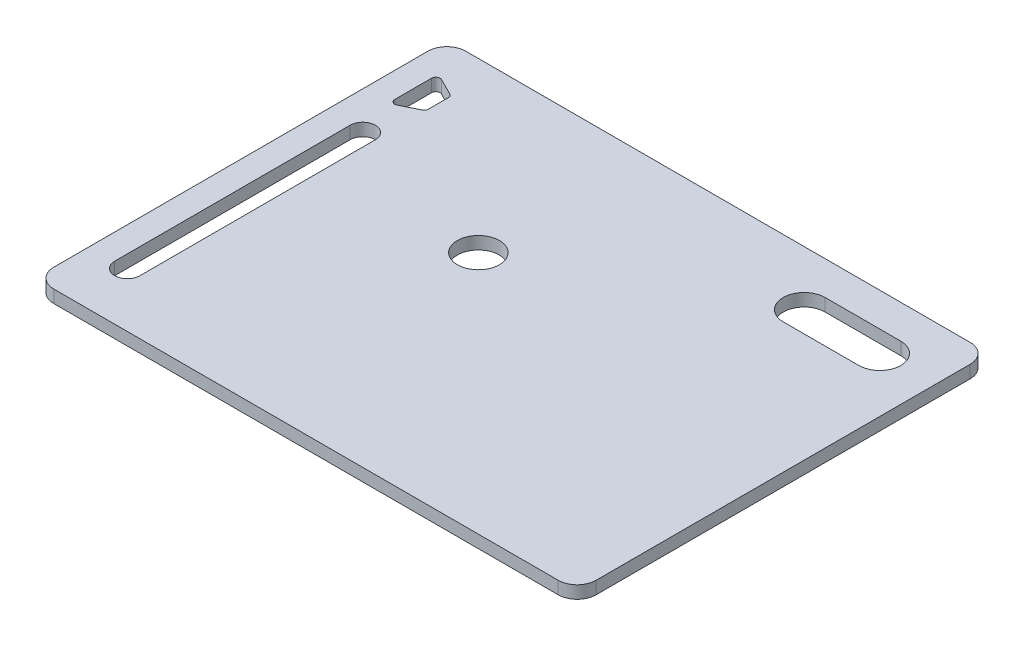
ISO-10303-21;
HEADER;
FILE_DESCRIPTION(('STEP AP214'),'2;1');
FILE_NAME('part.step','',(''),(''),'','','');
FILE_SCHEMA(('AUTOMOTIVE_DESIGN { 1 0 10303 214 1 1 1 1 }'));
ENDSEC;
DATA;
#1=APPLICATION_CONTEXT('core data for automotive mechanical design processes');
#2=APPLICATION_PROTOCOL_DEFINITION('international standard','automotive_design',2000,#1);
#3=PRODUCT_CONTEXT('',#1,'mechanical');
#4=PRODUCT('Part','Part','',(#3));
#5=PRODUCT_RELATED_PRODUCT_CATEGORY('part','',(#4));
#6=PRODUCT_DEFINITION_FORMATION('','',#4);
#7=PRODUCT_DEFINITION_CONTEXT('part definition',#1,'design');
#8=PRODUCT_DEFINITION('design','',#6,#7);
#9=PRODUCT_DEFINITION_SHAPE('','',#8);
#10=(LENGTH_UNIT() NAMED_UNIT(*) SI_UNIT(.MILLI.,.METRE.));
#11=(NAMED_UNIT(*) PLANE_ANGLE_UNIT() SI_UNIT($,.RADIAN.));
#12=(NAMED_UNIT(*) SI_UNIT($,.STERADIAN.) SOLID_ANGLE_UNIT());
#13=UNCERTAINTY_MEASURE_WITH_UNIT(LENGTH_MEASURE(1.E-05),#10,'distance_accuracy_value','');
#14=(GEOMETRIC_REPRESENTATION_CONTEXT(3) GLOBAL_UNCERTAINTY_ASSIGNED_CONTEXT((#13)) GLOBAL_UNIT_ASSIGNED_CONTEXT((#10,
#11,#12)) REPRESENTATION_CONTEXT('',''));
#15=CARTESIAN_POINT('',(0.,0.,0.));
#16=DIRECTION('',(0.,0.,1.));
#17=DIRECTION('',(1.,0.,0.));
#18=AXIS2_PLACEMENT_3D('',#15,#16,#17);
#19=CARTESIAN_POINT('',(409.575,19.05,311.15));
#20=DIRECTION('',(-1.,0.,0.));
#21=DIRECTION('',(0.,0.,1.));
#22=AXIS2_PLACEMENT_3D('',#19,#20,#21);
#23=PLANE('',#22);
#24=DIRECTION('',(0.,0.,-1.));
#25=VECTOR('',#24,1.);
#26=CARTESIAN_POINT('',(409.575,0.,311.15));
#27=LINE('',#26,#25);
#28=CARTESIAN_POINT('',(409.575,0.,282.575));
#29=VERTEX_POINT('',#28);
#30=CARTESIAN_POINT('',(409.575,0.,-282.575));
#31=VERTEX_POINT('',#30);
#32=EDGE_CURVE('E289',#29,#31,#27,.T.);
#33=ORIENTED_EDGE('',*,*,#32,.T.);
#34=DIRECTION('',(0.,-1.,0.));
#35=VECTOR('',#34,1.);
#36=CARTESIAN_POINT('',(409.575,19.05,-282.575));
#37=LINE('',#36,#35);
#38=CARTESIAN_POINT('',(409.575,19.05,-282.575));
#39=VERTEX_POINT('',#38);
#40=EDGE_CURVE('E344',#31,#39,#37,.F.);
#41=ORIENTED_EDGE('',*,*,#40,.T.);
#42=DIRECTION('',(0.,0.,-1.));
#43=VECTOR('',#42,1.);
#44=CARTESIAN_POINT('',(409.575,19.05,311.15));
#45=LINE('',#44,#43);
#46=CARTESIAN_POINT('',(409.575,19.05,282.575));
#47=VERTEX_POINT('',#46);
#48=EDGE_CURVE('E292',#47,#39,#45,.T.);
#49=ORIENTED_EDGE('',*,*,#48,.F.);
#50=DIRECTION('',(0.,-1.,0.));
#51=VECTOR('',#50,1.);
#52=CARTESIAN_POINT('',(409.575,19.05,282.575));
#53=LINE('',#52,#51);
#54=EDGE_CURVE('E341',#47,#29,#53,.T.);
#55=ORIENTED_EDGE('',*,*,#54,.T.);
#56=EDGE_LOOP('',(#33,#41,#49,#55));
#57=FACE_BOUND('',#56,.T.);
#58=ADVANCED_FACE('F33',(#57),#23,.F.);
#59=CARTESIAN_POINT('',(-409.575,19.05,-311.15));
#60=DIRECTION('',(0.,0.,1.));
#61=DIRECTION('',(1.,0.,0.));
#62=AXIS2_PLACEMENT_3D('',#59,#60,#61);
#63=PLANE('',#62);
#64=DIRECTION('',(-1.,0.,0.));
#65=VECTOR('',#64,1.);
#66=CARTESIAN_POINT('',(-409.575,0.,-311.15));
#67=LINE('',#66,#65);
#68=CARTESIAN_POINT('',(381.,0.,-311.15));
#69=VERTEX_POINT('',#68);
#70=CARTESIAN_POINT('',(-381.,0.,-311.15));
#71=VERTEX_POINT('',#70);
#72=EDGE_CURVE('E308',#69,#71,#67,.T.);
#73=ORIENTED_EDGE('',*,*,#72,.T.);
#74=DIRECTION('',(0.,-1.,0.));
#75=VECTOR('',#74,1.);
#76=CARTESIAN_POINT('',(-381.,19.05,-311.15));
#77=LINE('',#76,#75);
#78=CARTESIAN_POINT('',(-381.,19.05,-311.15));
#79=VERTEX_POINT('',#78);
#80=EDGE_CURVE('E331',#71,#79,#77,.F.);
#81=ORIENTED_EDGE('',*,*,#80,.T.);
#82=DIRECTION('',(-1.,0.,0.));
#83=VECTOR('',#82,1.);
#84=CARTESIAN_POINT('',(-409.575,19.05,-311.15));
#85=LINE('',#84,#83);
#86=CARTESIAN_POINT('',(381.,19.05,-311.15));
#87=VERTEX_POINT('',#86);
#88=EDGE_CURVE('E295',#87,#79,#85,.T.);
#89=ORIENTED_EDGE('',*,*,#88,.F.);
#90=DIRECTION('',(0.,-1.,0.));
#91=VECTOR('',#90,1.);
#92=CARTESIAN_POINT('',(381.,19.05,-311.15));
#93=LINE('',#92,#91);
#94=EDGE_CURVE('E328',#87,#69,#93,.T.);
#95=ORIENTED_EDGE('',*,*,#94,.T.);
#96=EDGE_LOOP('',(#73,#81,#89,#95));
#97=FACE_BOUND('',#96,.T.);
#98=ADVANCED_FACE('F431',(#97),#63,.F.);
#99=CARTESIAN_POINT('',(-409.575,19.05,311.15));
#100=DIRECTION('',(1.,0.,0.));
#101=DIRECTION('',(0.,0.,-1.));
#102=AXIS2_PLACEMENT_3D('',#99,#100,#101);
#103=PLANE('',#102);
#104=DIRECTION('',(0.,0.,1.));
#105=VECTOR('',#104,1.);
#106=CARTESIAN_POINT('',(-409.575,19.05,311.15));
#107=LINE('',#106,#105);
#108=CARTESIAN_POINT('',(-409.575,19.05,-282.575));
#109=VERTEX_POINT('',#108);
#110=CARTESIAN_POINT('',(-409.575,19.05,282.575));
#111=VERTEX_POINT('',#110);
#112=EDGE_CURVE('E299',#109,#111,#107,.T.);
#113=ORIENTED_EDGE('',*,*,#112,.F.);
#114=DIRECTION('',(0.,-1.,0.));
#115=VECTOR('',#114,1.);
#116=CARTESIAN_POINT('',(-409.575,19.05,-282.575));
#117=LINE('',#116,#115);
#118=CARTESIAN_POINT('',(-409.575,0.,-282.575));
#119=VERTEX_POINT('',#118);
#120=EDGE_CURVE('E317',#109,#119,#117,.T.);
#121=ORIENTED_EDGE('',*,*,#120,.T.);
#122=DIRECTION('',(0.,0.,1.));
#123=VECTOR('',#122,1.);
#124=CARTESIAN_POINT('',(-409.575,0.,311.15));
#125=LINE('',#124,#123);
#126=CARTESIAN_POINT('',(-409.575,0.,282.575));
#127=VERTEX_POINT('',#126);
#128=EDGE_CURVE('E311',#119,#127,#125,.T.);
#129=ORIENTED_EDGE('',*,*,#128,.T.);
#130=DIRECTION('',(0.,-1.,0.));
#131=VECTOR('',#130,1.);
#132=CARTESIAN_POINT('',(-409.575,19.05,282.575));
#133=LINE('',#132,#131);
#134=EDGE_CURVE('E305',#127,#111,#133,.F.);
#135=ORIENTED_EDGE('',*,*,#134,.T.);
#136=EDGE_LOOP('',(#113,#121,#129,#135));
#137=FACE_BOUND('',#136,.T.);
#138=ADVANCED_FACE('F437',(#137),#103,.F.);
#139=CARTESIAN_POINT('',(-409.575,19.05,311.15));
#140=DIRECTION('',(0.,0.,-1.));
#141=DIRECTION('',(-1.,0.,0.));
#142=AXIS2_PLACEMENT_3D('',#139,#140,#141);
#143=PLANE('',#142);
#144=DIRECTION('',(1.,0.,0.));
#145=VECTOR('',#144,1.);
#146=CARTESIAN_POINT('',(-409.575,19.05,311.15));
#147=LINE('',#146,#145);
#148=CARTESIAN_POINT('',(-381.,19.05,311.15));
#149=VERTEX_POINT('',#148);
#150=CARTESIAN_POINT('',(381.,19.05,311.15));
#151=VERTEX_POINT('',#150);
#152=EDGE_CURVE('E302',#149,#151,#147,.T.);
#153=ORIENTED_EDGE('',*,*,#152,.F.);
#154=DIRECTION('',(0.,-1.,0.));
#155=VECTOR('',#154,1.);
#156=CARTESIAN_POINT('',(-381.,19.05,311.15));
#157=LINE('',#156,#155);
#158=CARTESIAN_POINT('',(-381.,0.,311.15));
#159=VERTEX_POINT('',#158);
#160=EDGE_CURVE('E348',#149,#159,#157,.T.);
#161=ORIENTED_EDGE('',*,*,#160,.T.);
#162=DIRECTION('',(1.,0.,0.));
#163=VECTOR('',#162,1.);
#164=CARTESIAN_POINT('',(-409.575,0.,311.15));
#165=LINE('',#164,#163);
#166=CARTESIAN_POINT('',(381.,0.,311.15));
#167=VERTEX_POINT('',#166);
#168=EDGE_CURVE('E296',#159,#167,#165,.T.);
#169=ORIENTED_EDGE('',*,*,#168,.T.);
#170=DIRECTION('',(0.,-1.,0.));
#171=VECTOR('',#170,1.);
#172=CARTESIAN_POINT('',(381.,19.05,311.15));
#173=LINE('',#172,#171);
#174=EDGE_CURVE('E346',#167,#151,#173,.F.);
#175=ORIENTED_EDGE('',*,*,#174,.T.);
#176=EDGE_LOOP('',(#153,#161,#169,#175));
#177=FACE_BOUND('',#176,.T.);
#178=ADVANCED_FACE('F485',(#177),#143,.F.);
#179=CARTESIAN_POINT('',(0.,19.05,0.));
#180=DIRECTION('',(0.,-1.,0.));
#181=DIRECTION('',(0.,0.,-1.));
#182=AXIS2_PLACEMENT_3D('',#179,#180,#181);
#183=PLANE('',#182);
#184=DIRECTION('',(-1.,0.,0.));
#185=VECTOR('',#184,1.);
#186=CARTESIAN_POINT('',(327.025,19.05,-260.35));
#187=LINE('',#186,#185);
#188=CARTESIAN_POINT('',(327.025,19.05,-260.35));
#189=VERTEX_POINT('',#188);
#190=CARTESIAN_POINT('',(212.725,19.05,-260.35));
#191=VERTEX_POINT('',#190);
#192=EDGE_CURVE('E220',#189,#191,#187,.T.);
#193=ORIENTED_EDGE('',*,*,#192,.F.);
#194=CARTESIAN_POINT('',(327.025,19.05,-228.6));
#195=DIRECTION('',(0.,1.,0.));
#196=DIRECTION('',(0.,0.,1.));
#197=AXIS2_PLACEMENT_3D('',#194,#195,#196);
#198=CIRCLE('',#197,31.75);
#199=CARTESIAN_POINT('',(327.025,19.05,-196.85));
#200=VERTEX_POINT('',#199);
#201=EDGE_CURVE('E48',#200,#189,#198,.T.);
#202=ORIENTED_EDGE('',*,*,#201,.F.);
#203=DIRECTION('',(1.,0.,0.));
#204=VECTOR('',#203,1.);
#205=CARTESIAN_POINT('',(327.025,19.05,-196.85));
#206=LINE('',#205,#204);
#207=CARTESIAN_POINT('',(212.725,19.05,-196.85));
#208=VERTEX_POINT('',#207);
#209=EDGE_CURVE('E211',#208,#200,#206,.T.);
#210=ORIENTED_EDGE('',*,*,#209,.F.);
#211=CARTESIAN_POINT('',(212.725,19.05,-228.6));
#212=DIRECTION('',(0.,1.,0.));
#213=DIRECTION('',(0.,0.,1.));
#214=AXIS2_PLACEMENT_3D('',#211,#212,#213);
#215=CIRCLE('',#214,31.7499999999999);
#216=EDGE_CURVE('E214',#191,#208,#215,.T.);
#217=ORIENTED_EDGE('',*,*,#216,.F.);
#218=EDGE_LOOP('',(#193,#202,#210,#217));
#219=FACE_BOUND('',#218,.T.);
#220=DIRECTION('',(0.,0.,1.));
#221=VECTOR('',#220,1.);
#222=CARTESIAN_POINT('',(-371.475,19.05,-260.35));
#223=LINE('',#222,#221);
#224=CARTESIAN_POINT('',(-371.475,19.05,-250.075484171438));
#225=VERTEX_POINT('',#224);
#226=CARTESIAN_POINT('',(-371.475,19.05,-194.424515828562));
#227=VERTEX_POINT('',#226);
#228=EDGE_CURVE('E246',#225,#227,#223,.T.);
#229=ORIENTED_EDGE('',*,*,#228,.F.);
#230=CARTESIAN_POINT('',(-365.125,19.05,-250.075484171438));
#231=DIRECTION('',(0.,-1.,0.));
#232=DIRECTION('',(0.,0.,-1.));
#233=AXIS2_PLACEMENT_3D('',#230,#231,#232);
#234=CIRCLE('',#233,6.35);
#235=CARTESIAN_POINT('',(-362.285193668575,19.05,-255.755096834288));
#236=VERTEX_POINT('',#235);
#237=EDGE_CURVE('E41',#225,#236,#234,.T.);
#238=ORIENTED_EDGE('',*,*,#237,.T.);
#239=DIRECTION('',(-0.894427190999916,0.,-0.447213595499957));
#240=VECTOR('',#239,1.);
#241=CARTESIAN_POINT('',(-333.375,19.05,-241.3));
#242=LINE('',#241,#240);
#243=CARTESIAN_POINT('',(-336.885193668575,19.05,-243.055096834288));
#244=VERTEX_POINT('',#243);
#245=EDGE_CURVE('E226',#244,#236,#242,.T.);
#246=ORIENTED_EDGE('',*,*,#245,.F.);
#247=CARTESIAN_POINT('',(-339.725,19.05,-237.375484171438));
#248=DIRECTION('',(0.,-1.,0.));
#249=DIRECTION('',(0.,0.,-1.));
#250=AXIS2_PLACEMENT_3D('',#247,#248,#249);
#251=CIRCLE('',#250,6.35);
#252=CARTESIAN_POINT('',(-333.375,19.05,-237.375484171438));
#253=VERTEX_POINT('',#252);
#254=EDGE_CURVE('E371',#244,#253,#251,.T.);
#255=ORIENTED_EDGE('',*,*,#254,.T.);
#256=DIRECTION('',(0.,0.,-1.));
#257=VECTOR('',#256,1.);
#258=CARTESIAN_POINT('',(-333.375,19.05,-203.2));
#259=LINE('',#258,#257);
#260=CARTESIAN_POINT('',(-333.375,19.05,-207.124515828562));
#261=VERTEX_POINT('',#260);
#262=EDGE_CURVE('E234',#261,#253,#259,.T.);
#263=ORIENTED_EDGE('',*,*,#262,.F.);
#264=CARTESIAN_POINT('',(-339.725,19.05,-207.124515828562));
#265=DIRECTION('',(0.,-1.,0.));
#266=DIRECTION('',(0.,0.,-1.));
#267=AXIS2_PLACEMENT_3D('',#264,#265,#266);
#268=CIRCLE('',#267,6.35);
#269=CARTESIAN_POINT('',(-336.885193668575,19.05,-201.444903165712));
#270=VERTEX_POINT('',#269);
#271=EDGE_CURVE('E375',#261,#270,#268,.T.);
#272=ORIENTED_EDGE('',*,*,#271,.T.);
#273=DIRECTION('',(0.894427190999916,0.,-0.447213595499957));
#274=VECTOR('',#273,1.);
#275=CARTESIAN_POINT('',(-371.475,19.05,-184.15));
#276=LINE('',#275,#274);
#277=CARTESIAN_POINT('',(-362.285193668575,19.05,-188.744903165712));
#278=VERTEX_POINT('',#277);
#279=EDGE_CURVE('E249',#278,#270,#276,.T.);
#280=ORIENTED_EDGE('',*,*,#279,.F.);
#281=CARTESIAN_POINT('',(-365.125,19.05,-194.424515828562));
#282=DIRECTION('',(0.,-1.,0.));
#283=DIRECTION('',(0.,0.,-1.));
#284=AXIS2_PLACEMENT_3D('',#281,#282,#283);
#285=CIRCLE('',#284,6.35);
#286=EDGE_CURVE('E379',#278,#227,#285,.T.);
#287=ORIENTED_EDGE('',*,*,#286,.T.);
#288=EDGE_LOOP('',(#229,#238,#246,#255,#263,#272,#280,#287));
#289=FACE_BOUND('',#288,.T.);
#290=DIRECTION('',(0.,0.,1.));
#291=VECTOR('',#290,1.);
#292=CARTESIAN_POINT('',(-371.475,19.05,-127.));
#293=LINE('',#292,#291);
#294=CARTESIAN_POINT('',(-371.475,19.05,-127.));
#295=VERTEX_POINT('',#294);
#296=CARTESIAN_POINT('',(-371.475,19.05,228.6));
#297=VERTEX_POINT('',#296);
#298=EDGE_CURVE('E269',#295,#297,#293,.T.);
#299=ORIENTED_EDGE('',*,*,#298,.F.);
#300=CARTESIAN_POINT('',(-352.425,19.05,-127.));
#301=DIRECTION('',(0.,1.,0.));
#302=DIRECTION('',(0.,0.,1.));
#303=AXIS2_PLACEMENT_3D('',#300,#301,#302);
#304=CIRCLE('',#303,19.05);
#305=CARTESIAN_POINT('',(-333.375,19.05,-127.));
#306=VERTEX_POINT('',#305);
#307=EDGE_CURVE('E243',#306,#295,#304,.T.);
#308=ORIENTED_EDGE('',*,*,#307,.F.);
#309=DIRECTION('',(0.,0.,-1.));
#310=VECTOR('',#309,1.);
#311=CARTESIAN_POINT('',(-333.375,19.05,-127.));
#312=LINE('',#311,#310);
#313=CARTESIAN_POINT('',(-333.375,19.05,228.6));
#314=VERTEX_POINT('',#313);
#315=EDGE_CURVE('E258',#314,#306,#312,.T.);
#316=ORIENTED_EDGE('',*,*,#315,.F.);
#317=CARTESIAN_POINT('',(-352.425,19.05,228.6));
#318=DIRECTION('',(0.,1.,0.));
#319=DIRECTION('',(0.,0.,1.));
#320=AXIS2_PLACEMENT_3D('',#317,#318,#319);
#321=CIRCLE('',#320,19.0500000000001);
#322=EDGE_CURVE('E272',#297,#314,#321,.T.);
#323=ORIENTED_EDGE('',*,*,#322,.F.);
#324=EDGE_LOOP('',(#299,#308,#316,#323));
#325=FACE_BOUND('',#324,.T.);
#326=CARTESIAN_POINT('',(-107.95,19.05,-57.15));
#327=DIRECTION('',(0.,1.,0.));
#328=DIRECTION('',(0.,0.,1.));
#329=AXIS2_PLACEMENT_3D('',#326,#327,#328);
#330=CIRCLE('',#329,31.75);
#331=CARTESIAN_POINT('',(-107.95,19.05,-25.4));
#332=VERTEX_POINT('',#331);
#333=EDGE_CURVE('E279',#332,#332,#330,.T.);
#334=ORIENTED_EDGE('',*,*,#333,.F.);
#335=EDGE_LOOP('',(#334));
#336=FACE_BOUND('',#335,.T.);
#337=ORIENTED_EDGE('',*,*,#88,.T.);
#338=CARTESIAN_POINT('',(-381.,19.05,-282.575));
#339=DIRECTION('',(0.,-1.,0.));
#340=DIRECTION('',(0.,0.,-1.));
#341=AXIS2_PLACEMENT_3D('',#338,#339,#340);
#342=CIRCLE('',#341,28.575);
#343=EDGE_CURVE('E339',#79,#109,#342,.F.);
#344=ORIENTED_EDGE('',*,*,#343,.T.);
#345=ORIENTED_EDGE('',*,*,#112,.T.);
#346=CARTESIAN_POINT('',(-381.,19.05,282.575));
#347=DIRECTION('',(0.,-1.,0.));
#348=DIRECTION('',(0.,0.,-1.));
#349=AXIS2_PLACEMENT_3D('',#346,#347,#348);
#350=CIRCLE('',#349,28.575);
#351=EDGE_CURVE('E335',#111,#149,#350,.F.);
#352=ORIENTED_EDGE('',*,*,#351,.T.);
#353=ORIENTED_EDGE('',*,*,#152,.T.);
#354=CARTESIAN_POINT('',(381.,19.05,282.575));
#355=DIRECTION('',(0.,-1.,0.));
#356=DIRECTION('',(0.,0.,-1.));
#357=AXIS2_PLACEMENT_3D('',#354,#355,#356);
#358=CIRCLE('',#357,28.575);
#359=EDGE_CURVE('E333',#151,#47,#358,.F.);
#360=ORIENTED_EDGE('',*,*,#359,.T.);
#361=ORIENTED_EDGE('',*,*,#48,.T.);
#362=CARTESIAN_POINT('',(381.,19.05,-282.575));
#363=DIRECTION('',(0.,-1.,0.));
#364=DIRECTION('',(0.,0.,-1.));
#365=AXIS2_PLACEMENT_3D('',#362,#363,#364);
#366=CIRCLE('',#365,28.575);
#367=EDGE_CURVE('E337',#39,#87,#366,.F.);
#368=ORIENTED_EDGE('',*,*,#367,.T.);
#369=EDGE_LOOP('',(#337,#344,#345,#352,#353,#360,#361,#368));
#370=FACE_BOUND('',#369,.T.);
#371=ADVANCED_FACE('F385',(#219,#289,#325,#336,#370),#183,.F.);
#372=CARTESIAN_POINT('',(0.,0.,0.));
#373=DIRECTION('',(0.,-1.,0.));
#374=DIRECTION('',(0.,0.,-1.));
#375=AXIS2_PLACEMENT_3D('',#372,#373,#374);
#376=PLANE('',#375);
#377=CARTESIAN_POINT('',(327.025,0.,-228.6));
#378=DIRECTION('',(0.,1.,0.));
#379=DIRECTION('',(0.,0.,1.));
#380=AXIS2_PLACEMENT_3D('',#377,#378,#379);
#381=CIRCLE('',#380,31.75);
#382=CARTESIAN_POINT('',(327.025,0.,-196.85));
#383=VERTEX_POINT('',#382);
#384=CARTESIAN_POINT('',(327.025,0.,-260.35));
#385=VERTEX_POINT('',#384);
#386=EDGE_CURVE('E195',#383,#385,#381,.T.);
#387=ORIENTED_EDGE('',*,*,#386,.T.);
#388=DIRECTION('',(-1.,0.,0.));
#389=VECTOR('',#388,1.);
#390=CARTESIAN_POINT('',(327.025,0.,-260.35));
#391=LINE('',#390,#389);
#392=CARTESIAN_POINT('',(212.725,0.,-260.35));
#393=VERTEX_POINT('',#392);
#394=EDGE_CURVE('E204',#385,#393,#391,.T.);
#395=ORIENTED_EDGE('',*,*,#394,.T.);
#396=CARTESIAN_POINT('',(212.725,0.,-228.6));
#397=DIRECTION('',(0.,1.,0.));
#398=DIRECTION('',(0.,0.,1.));
#399=AXIS2_PLACEMENT_3D('',#396,#397,#398);
#400=CIRCLE('',#399,31.7499999999999);
#401=CARTESIAN_POINT('',(212.725,0.,-196.85));
#402=VERTEX_POINT('',#401);
#403=EDGE_CURVE('E56',#393,#402,#400,.T.);
#404=ORIENTED_EDGE('',*,*,#403,.T.);
#405=DIRECTION('',(1.,0.,0.));
#406=VECTOR('',#405,1.);
#407=CARTESIAN_POINT('',(327.025,0.,-196.85));
#408=LINE('',#407,#406);
#409=EDGE_CURVE('E201',#402,#383,#408,.T.);
#410=ORIENTED_EDGE('',*,*,#409,.T.);
#411=EDGE_LOOP('',(#387,#395,#404,#410));
#412=FACE_BOUND('',#411,.T.);
#413=DIRECTION('',(0.,0.,-1.));
#414=VECTOR('',#413,1.);
#415=CARTESIAN_POINT('',(-333.375,0.,-203.2));
#416=LINE('',#415,#414);
#417=CARTESIAN_POINT('',(-333.375,0.,-207.124515828562));
#418=VERTEX_POINT('',#417);
#419=CARTESIAN_POINT('',(-333.375,0.,-237.375484171438));
#420=VERTEX_POINT('',#419);
#421=EDGE_CURVE('E240',#418,#420,#416,.T.);
#422=ORIENTED_EDGE('',*,*,#421,.T.);
#423=CARTESIAN_POINT('',(-339.725,0.,-237.375484171438));
#424=DIRECTION('',(0.,-1.,0.));
#425=DIRECTION('',(0.,0.,-1.));
#426=AXIS2_PLACEMENT_3D('',#423,#424,#425);
#427=CIRCLE('',#426,6.35);
#428=CARTESIAN_POINT('',(-336.885193668575,0.,-243.055096834288));
#429=VERTEX_POINT('',#428);
#430=EDGE_CURVE('E373',#420,#429,#427,.F.);
#431=ORIENTED_EDGE('',*,*,#430,.T.);
#432=DIRECTION('',(-0.894427190999916,0.,-0.447213595499957));
#433=VECTOR('',#432,1.);
#434=CARTESIAN_POINT('',(-333.375,0.,-241.3));
#435=LINE('',#434,#433);
#436=CARTESIAN_POINT('',(-362.285193668575,0.,-255.755096834288));
#437=VERTEX_POINT('',#436);
#438=EDGE_CURVE('E230',#429,#437,#435,.T.);
#439=ORIENTED_EDGE('',*,*,#438,.T.);
#440=CARTESIAN_POINT('',(-365.125,0.,-250.075484171438));
#441=DIRECTION('',(0.,-1.,0.));
#442=DIRECTION('',(0.,0.,-1.));
#443=AXIS2_PLACEMENT_3D('',#440,#441,#442);
#444=CIRCLE('',#443,6.35);
#445=CARTESIAN_POINT('',(-371.475,0.,-250.075484171438));
#446=VERTEX_POINT('',#445);
#447=EDGE_CURVE('E11',#437,#446,#444,.F.);
#448=ORIENTED_EDGE('',*,*,#447,.T.);
#449=DIRECTION('',(0.,0.,1.));
#450=VECTOR('',#449,1.);
#451=CARTESIAN_POINT('',(-371.475,0.,-260.35));
#452=LINE('',#451,#450);
#453=CARTESIAN_POINT('',(-371.475,0.,-194.424515828562));
#454=VERTEX_POINT('',#453);
#455=EDGE_CURVE('E233',#446,#454,#452,.T.);
#456=ORIENTED_EDGE('',*,*,#455,.T.);
#457=CARTESIAN_POINT('',(-365.125,0.,-194.424515828562));
#458=DIRECTION('',(0.,-1.,0.));
#459=DIRECTION('',(0.,0.,-1.));
#460=AXIS2_PLACEMENT_3D('',#457,#458,#459);
#461=CIRCLE('',#460,6.35);
#462=CARTESIAN_POINT('',(-362.285193668575,0.,-188.744903165712));
#463=VERTEX_POINT('',#462);
#464=EDGE_CURVE('E381',#454,#463,#461,.F.);
#465=ORIENTED_EDGE('',*,*,#464,.T.);
#466=DIRECTION('',(0.894427190999916,0.,-0.447213595499957));
#467=VECTOR('',#466,1.);
#468=CARTESIAN_POINT('',(-371.475,0.,-184.15));
#469=LINE('',#468,#467);
#470=CARTESIAN_POINT('',(-336.885193668575,0.,-201.444903165712));
#471=VERTEX_POINT('',#470);
#472=EDGE_CURVE('E237',#463,#471,#469,.T.);
#473=ORIENTED_EDGE('',*,*,#472,.T.);
#474=CARTESIAN_POINT('',(-339.725,0.,-207.124515828562));
#475=DIRECTION('',(0.,-1.,0.));
#476=DIRECTION('',(0.,0.,-1.));
#477=AXIS2_PLACEMENT_3D('',#474,#475,#476);
#478=CIRCLE('',#477,6.35);
#479=EDGE_CURVE('E377',#471,#418,#478,.F.);
#480=ORIENTED_EDGE('',*,*,#479,.T.);
#481=EDGE_LOOP('',(#422,#431,#439,#448,#456,#465,#473,#480));
#482=FACE_BOUND('',#481,.T.);
#483=CARTESIAN_POINT('',(-352.425,0.,-127.));
#484=DIRECTION('',(0.,1.,0.));
#485=DIRECTION('',(0.,0.,1.));
#486=AXIS2_PLACEMENT_3D('',#483,#484,#485);
#487=CIRCLE('',#486,19.05);
#488=CARTESIAN_POINT('',(-333.375,0.,-127.));
#489=VERTEX_POINT('',#488);
#490=CARTESIAN_POINT('',(-371.475,0.,-127.));
#491=VERTEX_POINT('',#490);
#492=EDGE_CURVE('E254',#489,#491,#487,.T.);
#493=ORIENTED_EDGE('',*,*,#492,.T.);
#494=DIRECTION('',(0.,0.,1.));
#495=VECTOR('',#494,1.);
#496=CARTESIAN_POINT('',(-371.475,0.,-127.));
#497=LINE('',#496,#495);
#498=CARTESIAN_POINT('',(-371.475,0.,228.6));
#499=VERTEX_POINT('',#498);
#500=EDGE_CURVE('E257',#491,#499,#497,.T.);
#501=ORIENTED_EDGE('',*,*,#500,.T.);
#502=CARTESIAN_POINT('',(-352.425,0.,228.6));
#503=DIRECTION('',(0.,1.,0.));
#504=DIRECTION('',(0.,0.,1.));
#505=AXIS2_PLACEMENT_3D('',#502,#503,#504);
#506=CIRCLE('',#505,19.0500000000001);
#507=CARTESIAN_POINT('',(-333.375,0.,228.6));
#508=VERTEX_POINT('',#507);
#509=EDGE_CURVE('E261',#499,#508,#506,.T.);
#510=ORIENTED_EDGE('',*,*,#509,.T.);
#511=DIRECTION('',(0.,0.,-1.));
#512=VECTOR('',#511,1.);
#513=CARTESIAN_POINT('',(-333.375,0.,-127.));
#514=LINE('',#513,#512);
#515=EDGE_CURVE('E264',#508,#489,#514,.T.);
#516=ORIENTED_EDGE('',*,*,#515,.T.);
#517=EDGE_LOOP('',(#493,#501,#510,#516));
#518=FACE_BOUND('',#517,.T.);
#519=CARTESIAN_POINT('',(-107.95,0.,-57.15));
#520=DIRECTION('',(0.,1.,0.));
#521=DIRECTION('',(0.,0.,1.));
#522=AXIS2_PLACEMENT_3D('',#519,#520,#521);
#523=CIRCLE('',#522,31.75);
#524=CARTESIAN_POINT('',(-107.95,0.,-25.4));
#525=VERTEX_POINT('',#524);
#526=EDGE_CURVE('E286',#525,#525,#523,.T.);
#527=ORIENTED_EDGE('',*,*,#526,.T.);
#528=EDGE_LOOP('',(#527));
#529=FACE_BOUND('',#528,.T.);
#530=ORIENTED_EDGE('',*,*,#128,.F.);
#531=CARTESIAN_POINT('',(-381.,0.,-282.575));
#532=DIRECTION('',(0.,-1.,0.));
#533=DIRECTION('',(0.,0.,-1.));
#534=AXIS2_PLACEMENT_3D('',#531,#532,#533);
#535=CIRCLE('',#534,28.575);
#536=EDGE_CURVE('E326',#119,#71,#535,.T.);
#537=ORIENTED_EDGE('',*,*,#536,.T.);
#538=ORIENTED_EDGE('',*,*,#72,.F.);
#539=CARTESIAN_POINT('',(381.,0.,-282.575));
#540=DIRECTION('',(0.,-1.,0.));
#541=DIRECTION('',(0.,0.,-1.));
#542=AXIS2_PLACEMENT_3D('',#539,#540,#541);
#543=CIRCLE('',#542,28.575);
#544=EDGE_CURVE('E324',#69,#31,#543,.T.);
#545=ORIENTED_EDGE('',*,*,#544,.T.);
#546=ORIENTED_EDGE('',*,*,#32,.F.);
#547=CARTESIAN_POINT('',(381.,0.,282.575));
#548=DIRECTION('',(0.,-1.,0.));
#549=DIRECTION('',(0.,0.,-1.));
#550=AXIS2_PLACEMENT_3D('',#547,#548,#549);
#551=CIRCLE('',#550,28.575);
#552=EDGE_CURVE('E320',#29,#167,#551,.T.);
#553=ORIENTED_EDGE('',*,*,#552,.T.);
#554=ORIENTED_EDGE('',*,*,#168,.F.);
#555=CARTESIAN_POINT('',(-381.,0.,282.575));
#556=DIRECTION('',(0.,-1.,0.));
#557=DIRECTION('',(0.,0.,-1.));
#558=AXIS2_PLACEMENT_3D('',#555,#556,#557);
#559=CIRCLE('',#558,28.575);
#560=EDGE_CURVE('E322',#159,#127,#559,.T.);
#561=ORIENTED_EDGE('',*,*,#560,.T.);
#562=EDGE_LOOP('',(#530,#537,#538,#545,#546,#553,#554,#561));
#563=FACE_BOUND('',#562,.T.);
#564=ADVANCED_FACE('F208',(#412,#482,#518,#529,#563),#376,.T.);
#565=CARTESIAN_POINT('',(-381.,19.05,-282.575));
#566=DIRECTION('',(0.,-1.,0.));
#567=DIRECTION('',(0.,0.,-1.));
#568=AXIS2_PLACEMENT_3D('',#565,#566,#567);
#569=CYLINDRICAL_SURFACE('',#568,28.575);
#570=ORIENTED_EDGE('',*,*,#343,.F.);
#571=ORIENTED_EDGE('',*,*,#80,.F.);
#572=ORIENTED_EDGE('',*,*,#536,.F.);
#573=ORIENTED_EDGE('',*,*,#120,.F.);
#574=EDGE_LOOP('',(#570,#571,#572,#573));
#575=FACE_BOUND('',#574,.T.);
#576=ADVANCED_FACE('F442',(#575),#569,.T.);
#577=CARTESIAN_POINT('',(381.,19.05,-282.575));
#578=DIRECTION('',(0.,-1.,0.));
#579=DIRECTION('',(0.,0.,-1.));
#580=AXIS2_PLACEMENT_3D('',#577,#578,#579);
#581=CYLINDRICAL_SURFACE('',#580,28.575);
#582=ORIENTED_EDGE('',*,*,#367,.F.);
#583=ORIENTED_EDGE('',*,*,#40,.F.);
#584=ORIENTED_EDGE('',*,*,#544,.F.);
#585=ORIENTED_EDGE('',*,*,#94,.F.);
#586=EDGE_LOOP('',(#582,#583,#584,#585));
#587=FACE_BOUND('',#586,.T.);
#588=ADVANCED_FACE('F445',(#587),#581,.T.);
#589=CARTESIAN_POINT('',(-381.,19.05,282.575));
#590=DIRECTION('',(0.,-1.,0.));
#591=DIRECTION('',(0.,0.,-1.));
#592=AXIS2_PLACEMENT_3D('',#589,#590,#591);
#593=CYLINDRICAL_SURFACE('',#592,28.575);
#594=ORIENTED_EDGE('',*,*,#351,.F.);
#595=ORIENTED_EDGE('',*,*,#134,.F.);
#596=ORIENTED_EDGE('',*,*,#560,.F.);
#597=ORIENTED_EDGE('',*,*,#160,.F.);
#598=EDGE_LOOP('',(#594,#595,#596,#597));
#599=FACE_BOUND('',#598,.T.);
#600=ADVANCED_FACE('F449',(#599),#593,.T.);
#601=CARTESIAN_POINT('',(381.,19.05,282.575));
#602=DIRECTION('',(0.,-1.,0.));
#603=DIRECTION('',(0.,0.,-1.));
#604=AXIS2_PLACEMENT_3D('',#601,#602,#603);
#605=CYLINDRICAL_SURFACE('',#604,28.575);
#606=ORIENTED_EDGE('',*,*,#359,.F.);
#607=ORIENTED_EDGE('',*,*,#174,.F.);
#608=ORIENTED_EDGE('',*,*,#552,.F.);
#609=ORIENTED_EDGE('',*,*,#54,.F.);
#610=EDGE_LOOP('',(#606,#607,#608,#609));
#611=FACE_BOUND('',#610,.T.);
#612=ADVANCED_FACE('F452',(#611),#605,.T.);
#613=CARTESIAN_POINT('',(-107.95,0.,-57.15));
#614=DIRECTION('',(0.,1.,0.));
#615=DIRECTION('',(0.,0.,1.));
#616=AXIS2_PLACEMENT_3D('',#613,#614,#615);
#617=CYLINDRICAL_SURFACE('',#616,31.75);
#618=CARTESIAN_POINT('',(-107.95,0.,-25.4));
#619=CARTESIAN_POINT('',(-107.95,0.1984375,-25.4));
#620=CARTESIAN_POINT('',(-107.95,0.396875,-25.4));
#621=CARTESIAN_POINT('',(-107.95,0.79375,-25.4));
#622=CARTESIAN_POINT('',(-107.95,0.9921875,-25.4));
#623=CARTESIAN_POINT('',(-107.95,1.3890625,-25.4));
#624=CARTESIAN_POINT('',(-107.95,1.5875,-25.4));
#625=CARTESIAN_POINT('',(-107.95,1.984375,-25.4));
#626=CARTESIAN_POINT('',(-107.95,2.1828125,-25.4));
#627=CARTESIAN_POINT('',(-107.95,2.5796875,-25.4));
#628=CARTESIAN_POINT('',(-107.95,2.778125,-25.4));
#629=CARTESIAN_POINT('',(-107.95,3.175,-25.4));
#630=CARTESIAN_POINT('',(-107.95,3.3734375,-25.4));
#631=CARTESIAN_POINT('',(-107.95,3.7703125,-25.4));
#632=CARTESIAN_POINT('',(-107.95,3.96875,-25.4));
#633=CARTESIAN_POINT('',(-107.95,4.365625,-25.4));
#634=CARTESIAN_POINT('',(-107.95,4.5640625,-25.4));
#635=CARTESIAN_POINT('',(-107.95,4.9609375,-25.4));
#636=CARTESIAN_POINT('',(-107.95,5.159375,-25.4));
#637=CARTESIAN_POINT('',(-107.95,5.55625,-25.4));
#638=CARTESIAN_POINT('',(-107.95,5.7546875,-25.4));
#639=CARTESIAN_POINT('',(-107.95,6.1515625,-25.4));
#640=CARTESIAN_POINT('',(-107.95,6.35,-25.4));
#641=CARTESIAN_POINT('',(-107.95,6.746875,-25.4));
#642=CARTESIAN_POINT('',(-107.95,6.9453125,-25.4));
#643=CARTESIAN_POINT('',(-107.95,7.3421875,-25.4));
#644=CARTESIAN_POINT('',(-107.95,7.540625,-25.4));
#645=CARTESIAN_POINT('',(-107.95,7.9375,-25.4));
#646=CARTESIAN_POINT('',(-107.95,8.1359375,-25.4));
#647=CARTESIAN_POINT('',(-107.95,8.5328125,-25.4));
#648=CARTESIAN_POINT('',(-107.95,8.73125,-25.4));
#649=CARTESIAN_POINT('',(-107.95,9.128125,-25.4));
#650=CARTESIAN_POINT('',(-107.95,9.3265625,-25.4));
#651=CARTESIAN_POINT('',(-107.95,9.7234375,-25.4));
#652=CARTESIAN_POINT('',(-107.95,9.921875,-25.4));
#653=CARTESIAN_POINT('',(-107.95,10.31875,-25.4));
#654=CARTESIAN_POINT('',(-107.95,10.5171875,-25.4));
#655=CARTESIAN_POINT('',(-107.95,10.9140625,-25.4));
#656=CARTESIAN_POINT('',(-107.95,11.1125,-25.4));
#657=CARTESIAN_POINT('',(-107.95,11.509375,-25.4));
#658=CARTESIAN_POINT('',(-107.95,11.7078125,-25.4));
#659=CARTESIAN_POINT('',(-107.95,12.1046875,-25.4));
#660=CARTESIAN_POINT('',(-107.95,12.303125,-25.4));
#661=CARTESIAN_POINT('',(-107.95,12.7,-25.4));
#662=CARTESIAN_POINT('',(-107.95,12.8984375,-25.4));
#663=CARTESIAN_POINT('',(-107.95,13.2953125,-25.4));
#664=CARTESIAN_POINT('',(-107.95,13.49375,-25.4));
#665=CARTESIAN_POINT('',(-107.95,13.890625,-25.4));
#666=CARTESIAN_POINT('',(-107.95,14.0890625,-25.4));
#667=CARTESIAN_POINT('',(-107.95,14.4859375,-25.4));
#668=CARTESIAN_POINT('',(-107.95,14.684375,-25.4));
#669=CARTESIAN_POINT('',(-107.95,15.08125,-25.4));
#670=CARTESIAN_POINT('',(-107.95,15.2796875,-25.4));
#671=CARTESIAN_POINT('',(-107.95,15.6765625,-25.4));
#672=CARTESIAN_POINT('',(-107.95,15.875,-25.4));
#673=CARTESIAN_POINT('',(-107.95,16.271875,-25.4));
#674=CARTESIAN_POINT('',(-107.95,16.4703125,-25.4));
#675=CARTESIAN_POINT('',(-107.95,16.8671875,-25.4));
#676=CARTESIAN_POINT('',(-107.95,17.065625,-25.4));
#677=CARTESIAN_POINT('',(-107.95,17.4625,-25.4));
#678=CARTESIAN_POINT('',(-107.95,17.6609375,-25.4));
#679=CARTESIAN_POINT('',(-107.95,18.0578125,-25.4));
#680=CARTESIAN_POINT('',(-107.95,18.25625,-25.4));
#681=CARTESIAN_POINT('',(-107.95,18.653125,-25.4));
#682=CARTESIAN_POINT('',(-107.95,18.8515625,-25.4));
#683=CARTESIAN_POINT('',(-107.95,19.05,-25.4));
#684=B_SPLINE_CURVE_WITH_KNOTS('',3,(#618,#619,#620,#621,#622,#623,#624,#625,#626,#627,#628,
#629,#630,#631,#632,#633,#634,#635,#636,#637,#638,#639,#640,#641,#642,#643,#644,#645,#646,#647,
#648,#649,#650,#651,#652,#653,#654,#655,#656,#657,#658,#659,#660,#661,#662,#663,#664,#665,#666,
#667,#668,#669,#670,#671,#672,#673,#674,#675,#676,#677,#678,#679,#680,#681,#682,#683),
.UNSPECIFIED.,.F.,.F.,(4,2,2,2,2,2,2,2,2,2,2,2,2,2,2,2,2,2,2,2,2,2,2,2,2,2,2,2,2,2,2,2,4),(0.,
0.5953125,1.190625,1.7859375,2.38125,2.9765625,3.571875,4.1671875,4.7625,5.3578125,5.953125,
6.5484375,7.14375,7.7390625,8.334375,8.9296875,9.525,10.1203125,10.715625,11.3109375,11.90625,
12.5015625,13.096875,13.6921875,14.2875,14.8828125,15.478125,16.0734375,16.66875,17.2640625,
17.859375,18.4546875,19.05),.UNSPECIFIED.);
#685=EDGE_CURVE('BSEAM455',#525,#332,#684,.T.);
#686=ORIENTED_EDGE('',*,*,#526,.F.);
#687=ORIENTED_EDGE('',*,*,#333,.T.);
#688=ORIENTED_EDGE('',*,*,#685,.T.);
#689=ORIENTED_EDGE('',*,*,#685,.F.);
#690=EDGE_LOOP('',(#686,#688,#687,#689));
#691=FACE_BOUND('',#690,.T.);
#692=ADVANCED_FACE('F455',(#691),#617,.F.);
#693=CARTESIAN_POINT('',(-352.425,0.,-127.));
#694=DIRECTION('',(0.,1.,0.));
#695=DIRECTION('',(0.,0.,1.));
#696=AXIS2_PLACEMENT_3D('',#693,#694,#695);
#697=CYLINDRICAL_SURFACE('',#696,19.05);
#698=ORIENTED_EDGE('',*,*,#307,.T.);
#699=DIRECTION('',(0.,1.,0.));
#700=VECTOR('',#699,1.);
#701=CARTESIAN_POINT('',(-371.475,0.,-127.));
#702=LINE('',#701,#700);
#703=EDGE_CURVE('E267',#491,#295,#702,.T.);
#704=ORIENTED_EDGE('',*,*,#703,.F.);
#705=ORIENTED_EDGE('',*,*,#492,.F.);
#706=DIRECTION('',(0.,1.,0.));
#707=VECTOR('',#706,1.);
#708=CARTESIAN_POINT('',(-333.375,0.,-127.));
#709=LINE('',#708,#707);
#710=EDGE_CURVE('E277',#489,#306,#709,.T.);
#711=ORIENTED_EDGE('',*,*,#710,.T.);
#712=EDGE_LOOP('',(#698,#704,#705,#711));
#713=FACE_BOUND('',#712,.T.);
#714=ADVANCED_FACE('F460',(#713),#697,.F.);
#715=CARTESIAN_POINT('',(-333.375,0.,-127.));
#716=DIRECTION('',(1.,0.,0.));
#717=DIRECTION('',(0.,0.,-1.));
#718=AXIS2_PLACEMENT_3D('',#715,#716,#717);
#719=PLANE('',#718);
#720=ORIENTED_EDGE('',*,*,#315,.T.);
#721=ORIENTED_EDGE('',*,*,#710,.F.);
#722=ORIENTED_EDGE('',*,*,#515,.F.);
#723=DIRECTION('',(0.,1.,0.));
#724=VECTOR('',#723,1.);
#725=CARTESIAN_POINT('',(-333.375,0.,228.6));
#726=LINE('',#725,#724);
#727=EDGE_CURVE('E280',#508,#314,#726,.T.);
#728=ORIENTED_EDGE('',*,*,#727,.T.);
#729=EDGE_LOOP('',(#720,#721,#722,#728));
#730=FACE_BOUND('',#729,.T.);
#731=ADVANCED_FACE('F568',(#730),#719,.F.);
#732=CARTESIAN_POINT('',(-352.425,0.,228.6));
#733=DIRECTION('',(0.,1.,0.));
#734=DIRECTION('',(0.,0.,1.));
#735=AXIS2_PLACEMENT_3D('',#732,#733,#734);
#736=CYLINDRICAL_SURFACE('',#735,19.0500000000001);
#737=ORIENTED_EDGE('',*,*,#322,.T.);
#738=ORIENTED_EDGE('',*,*,#727,.F.);
#739=ORIENTED_EDGE('',*,*,#509,.F.);
#740=DIRECTION('',(0.,1.,0.));
#741=VECTOR('',#740,1.);
#742=CARTESIAN_POINT('',(-371.475,0.,228.6));
#743=LINE('',#742,#741);
#744=EDGE_CURVE('E282',#499,#297,#743,.T.);
#745=ORIENTED_EDGE('',*,*,#744,.T.);
#746=EDGE_LOOP('',(#737,#738,#739,#745));
#747=FACE_BOUND('',#746,.T.);
#748=ADVANCED_FACE('F571',(#747),#736,.F.);
#749=CARTESIAN_POINT('',(-371.475,0.,-127.));
#750=DIRECTION('',(-1.,0.,0.));
#751=DIRECTION('',(0.,0.,1.));
#752=AXIS2_PLACEMENT_3D('',#749,#750,#751);
#753=PLANE('',#752);
#754=ORIENTED_EDGE('',*,*,#298,.T.);
#755=ORIENTED_EDGE('',*,*,#744,.F.);
#756=ORIENTED_EDGE('',*,*,#500,.F.);
#757=ORIENTED_EDGE('',*,*,#703,.T.);
#758=EDGE_LOOP('',(#754,#755,#756,#757));
#759=FACE_BOUND('',#758,.T.);
#760=ADVANCED_FACE('F567',(#759),#753,.F.);
#761=CARTESIAN_POINT('',(-333.375,0.,-241.3));
#762=DIRECTION('',(0.447213595499957,0.,-0.894427190999916));
#763=DIRECTION('',(-0.894427190999917,0.,-0.447213595499957));
#764=AXIS2_PLACEMENT_3D('',#761,#762,#763);
#765=PLANE('',#764);
#766=ORIENTED_EDGE('',*,*,#438,.F.);
#767=DIRECTION('',(0.,1.,0.));
#768=VECTOR('',#767,1.);
#769=CARTESIAN_POINT('',(-336.885193668575,19.05,-243.055096834288));
#770=LINE('',#769,#768);
#771=EDGE_CURVE('E353',#429,#244,#770,.T.);
#772=ORIENTED_EDGE('',*,*,#771,.T.);
#773=ORIENTED_EDGE('',*,*,#245,.T.);
#774=DIRECTION('',(0.,1.,0.));
#775=VECTOR('',#774,1.);
#776=CARTESIAN_POINT('',(-362.285193668575,0.,-255.755096834288));
#777=LINE('',#776,#775);
#778=EDGE_CURVE('E351',#236,#437,#777,.F.);
#779=ORIENTED_EDGE('',*,*,#778,.T.);
#780=EDGE_LOOP('',(#766,#772,#773,#779));
#781=FACE_BOUND('',#780,.T.);
#782=ADVANCED_FACE('F392',(#781),#765,.F.);
#783=CARTESIAN_POINT('',(-333.375,0.,-203.2));
#784=DIRECTION('',(1.,0.,0.));
#785=DIRECTION('',(0.,0.,-1.));
#786=AXIS2_PLACEMENT_3D('',#783,#784,#785);
#787=PLANE('',#786);
#788=ORIENTED_EDGE('',*,*,#262,.T.);
#789=DIRECTION('',(0.,1.,0.));
#790=VECTOR('',#789,1.);
#791=CARTESIAN_POINT('',(-333.375,0.,-237.375484171438));
#792=LINE('',#791,#790);
#793=EDGE_CURVE('E359',#253,#420,#792,.F.);
#794=ORIENTED_EDGE('',*,*,#793,.T.);
#795=ORIENTED_EDGE('',*,*,#421,.F.);
#796=DIRECTION('',(0.,1.,0.));
#797=VECTOR('',#796,1.);
#798=CARTESIAN_POINT('',(-333.375,19.05,-207.124515828562));
#799=LINE('',#798,#797);
#800=EDGE_CURVE('E356',#418,#261,#799,.T.);
#801=ORIENTED_EDGE('',*,*,#800,.T.);
#802=EDGE_LOOP('',(#788,#794,#795,#801));
#803=FACE_BOUND('',#802,.T.);
#804=ADVANCED_FACE('F416',(#803),#787,.F.);
#805=CARTESIAN_POINT('',(-371.475,0.,-184.15));
#806=DIRECTION('',(0.447213595499958,0.,0.894427190999916));
#807=DIRECTION('',(0.894427190999916,0.,-0.447213595499958));
#808=AXIS2_PLACEMENT_3D('',#805,#806,#807);
#809=PLANE('',#808);
#810=ORIENTED_EDGE('',*,*,#279,.T.);
#811=DIRECTION('',(0.,1.,0.));
#812=VECTOR('',#811,1.);
#813=CARTESIAN_POINT('',(-336.885193668575,0.,-201.444903165712));
#814=LINE('',#813,#812);
#815=EDGE_CURVE('E364',#270,#471,#814,.F.);
#816=ORIENTED_EDGE('',*,*,#815,.T.);
#817=ORIENTED_EDGE('',*,*,#472,.F.);
#818=DIRECTION('',(0.,1.,0.));
#819=VECTOR('',#818,1.);
#820=CARTESIAN_POINT('',(-362.285193668575,19.05,-188.744903165712));
#821=LINE('',#820,#819);
#822=EDGE_CURVE('E361',#463,#278,#821,.T.);
#823=ORIENTED_EDGE('',*,*,#822,.T.);
#824=EDGE_LOOP('',(#810,#816,#817,#823));
#825=FACE_BOUND('',#824,.T.);
#826=ADVANCED_FACE('F407',(#825),#809,.F.);
#827=CARTESIAN_POINT('',(-371.475,0.,-260.35));
#828=DIRECTION('',(-1.,0.,0.));
#829=DIRECTION('',(0.,0.,1.));
#830=AXIS2_PLACEMENT_3D('',#827,#828,#829);
#831=PLANE('',#830);
#832=ORIENTED_EDGE('',*,*,#228,.T.);
#833=DIRECTION('',(0.,1.,0.));
#834=VECTOR('',#833,1.);
#835=CARTESIAN_POINT('',(-371.475,0.,-194.424515828562));
#836=LINE('',#835,#834);
#837=EDGE_CURVE('E369',#227,#454,#836,.F.);
#838=ORIENTED_EDGE('',*,*,#837,.T.);
#839=ORIENTED_EDGE('',*,*,#455,.F.);
#840=DIRECTION('',(0.,1.,0.));
#841=VECTOR('',#840,1.);
#842=CARTESIAN_POINT('',(-371.475,19.05,-250.075484171438));
#843=LINE('',#842,#841);
#844=EDGE_CURVE('E366',#446,#225,#843,.T.);
#845=ORIENTED_EDGE('',*,*,#844,.T.);
#846=EDGE_LOOP('',(#832,#838,#839,#845));
#847=FACE_BOUND('',#846,.T.);
#848=ADVANCED_FACE('F399',(#847),#831,.F.);
#849=CARTESIAN_POINT('',(-339.725,0.,-237.375484171438));
#850=DIRECTION('',(0.,-1.,0.));
#851=DIRECTION('',(0.,0.,-1.));
#852=AXIS2_PLACEMENT_3D('',#849,#850,#851);
#853=CYLINDRICAL_SURFACE('',#852,6.35);
#854=ORIENTED_EDGE('',*,*,#430,.F.);
#855=ORIENTED_EDGE('',*,*,#793,.F.);
#856=ORIENTED_EDGE('',*,*,#254,.F.);
#857=ORIENTED_EDGE('',*,*,#771,.F.);
#858=EDGE_LOOP('',(#854,#855,#856,#857));
#859=FACE_BOUND('',#858,.T.);
#860=ADVANCED_FACE('F420',(#859),#853,.F.);
#861=CARTESIAN_POINT('',(-339.725,0.,-207.124515828562));
#862=DIRECTION('',(0.,-1.,0.));
#863=DIRECTION('',(0.,0.,-1.));
#864=AXIS2_PLACEMENT_3D('',#861,#862,#863);
#865=CYLINDRICAL_SURFACE('',#864,6.35);
#866=ORIENTED_EDGE('',*,*,#479,.F.);
#867=ORIENTED_EDGE('',*,*,#815,.F.);
#868=ORIENTED_EDGE('',*,*,#271,.F.);
#869=ORIENTED_EDGE('',*,*,#800,.F.);
#870=EDGE_LOOP('',(#866,#867,#868,#869));
#871=FACE_BOUND('',#870,.T.);
#872=ADVANCED_FACE('F411',(#871),#865,.F.);
#873=CARTESIAN_POINT('',(-365.125,0.,-194.424515828562));
#874=DIRECTION('',(0.,-1.,0.));
#875=DIRECTION('',(0.,0.,-1.));
#876=AXIS2_PLACEMENT_3D('',#873,#874,#875);
#877=CYLINDRICAL_SURFACE('',#876,6.35);
#878=ORIENTED_EDGE('',*,*,#464,.F.);
#879=ORIENTED_EDGE('',*,*,#837,.F.);
#880=ORIENTED_EDGE('',*,*,#286,.F.);
#881=ORIENTED_EDGE('',*,*,#822,.F.);
#882=EDGE_LOOP('',(#878,#879,#880,#881));
#883=FACE_BOUND('',#882,.T.);
#884=ADVANCED_FACE('F402',(#883),#877,.F.);
#885=CARTESIAN_POINT('',(-365.125,0.,-250.075484171438));
#886=DIRECTION('',(0.,-1.,0.));
#887=DIRECTION('',(0.,0.,-1.));
#888=AXIS2_PLACEMENT_3D('',#885,#886,#887);
#889=CYLINDRICAL_SURFACE('',#888,6.35);
#890=ORIENTED_EDGE('',*,*,#447,.F.);
#891=ORIENTED_EDGE('',*,*,#778,.F.);
#892=ORIENTED_EDGE('',*,*,#237,.F.);
#893=ORIENTED_EDGE('',*,*,#844,.F.);
#894=EDGE_LOOP('',(#890,#891,#892,#893));
#895=FACE_BOUND('',#894,.T.);
#896=ADVANCED_FACE('F35',(#895),#889,.F.);
#897=CARTESIAN_POINT('',(327.025,0.,-228.6));
#898=DIRECTION('',(0.,1.,0.));
#899=DIRECTION('',(0.,0.,1.));
#900=AXIS2_PLACEMENT_3D('',#897,#898,#899);
#901=CYLINDRICAL_SURFACE('',#900,31.75);
#902=ORIENTED_EDGE('',*,*,#201,.T.);
#903=DIRECTION('',(0.,1.,0.));
#904=VECTOR('',#903,1.);
#905=CARTESIAN_POINT('',(327.025,0.,-260.35));
#906=LINE('',#905,#904);
#907=EDGE_CURVE('E191',#385,#189,#906,.T.);
#908=ORIENTED_EDGE('',*,*,#907,.F.);
#909=ORIENTED_EDGE('',*,*,#386,.F.);
#910=DIRECTION('',(0.,1.,0.));
#911=VECTOR('',#910,1.);
#912=CARTESIAN_POINT('',(327.025,0.,-196.85));
#913=LINE('',#912,#911);
#914=EDGE_CURVE('E224',#383,#200,#913,.T.);
#915=ORIENTED_EDGE('',*,*,#914,.T.);
#916=EDGE_LOOP('',(#902,#908,#909,#915));
#917=FACE_BOUND('',#916,.T.);
#918=ADVANCED_FACE('F193',(#917),#901,.F.);
#919=CARTESIAN_POINT('',(327.025,0.,-196.85));
#920=DIRECTION('',(0.,0.,1.));
#921=DIRECTION('',(1.,0.,0.));
#922=AXIS2_PLACEMENT_3D('',#919,#920,#921);
#923=PLANE('',#922);
#924=ORIENTED_EDGE('',*,*,#209,.T.);
#925=ORIENTED_EDGE('',*,*,#914,.F.);
#926=ORIENTED_EDGE('',*,*,#409,.F.);
#927=DIRECTION('',(0.,1.,0.));
#928=VECTOR('',#927,1.);
#929=CARTESIAN_POINT('',(212.725,0.,-196.85));
#930=LINE('',#929,#928);
#931=EDGE_CURVE('E227',#402,#208,#930,.T.);
#932=ORIENTED_EDGE('',*,*,#931,.T.);
#933=EDGE_LOOP('',(#924,#925,#926,#932));
#934=FACE_BOUND('',#933,.T.);
#935=ADVANCED_FACE('F530',(#934),#923,.F.);
#936=CARTESIAN_POINT('',(212.725,0.,-228.6));
#937=DIRECTION('',(0.,1.,0.));
#938=DIRECTION('',(0.,0.,1.));
#939=AXIS2_PLACEMENT_3D('',#936,#937,#938);
#940=CYLINDRICAL_SURFACE('',#939,31.7499999999999);
#941=ORIENTED_EDGE('',*,*,#216,.T.);
#942=ORIENTED_EDGE('',*,*,#931,.F.);
#943=ORIENTED_EDGE('',*,*,#403,.F.);
#944=DIRECTION('',(0.,1.,0.));
#945=VECTOR('',#944,1.);
#946=CARTESIAN_POINT('',(212.725,0.,-260.35));
#947=LINE('',#946,#945);
#948=EDGE_CURVE('E200',#393,#191,#947,.T.);
#949=ORIENTED_EDGE('',*,*,#948,.T.);
#950=EDGE_LOOP('',(#941,#942,#943,#949));
#951=FACE_BOUND('',#950,.T.);
#952=ADVANCED_FACE('F539',(#951),#940,.F.);
#953=CARTESIAN_POINT('',(327.025,0.,-260.35));
#954=DIRECTION('',(0.,0.,-1.));
#955=DIRECTION('',(-1.,0.,0.));
#956=AXIS2_PLACEMENT_3D('',#953,#954,#955);
#957=PLANE('',#956);
#958=ORIENTED_EDGE('',*,*,#192,.T.);
#959=ORIENTED_EDGE('',*,*,#948,.F.);
#960=ORIENTED_EDGE('',*,*,#394,.F.);
#961=ORIENTED_EDGE('',*,*,#907,.T.);
#962=EDGE_LOOP('',(#958,#959,#960,#961));
#963=FACE_BOUND('',#962,.T.);
#964=ADVANCED_FACE('F205',(#963),#957,.F.);
#965=CLOSED_SHELL('',(#58,#98,#138,#178,#371,#564,#576,#588,#600,#612,#692,#714,#731,#748,#760,
#782,#804,#826,#848,#860,#872,#884,#896,#918,#935,#952,#964));
#966=MANIFOLD_SOLID_BREP('B2',#965);
#967=ADVANCED_BREP_SHAPE_REPRESENTATION('',(#18,#966),#14);
#968=SHAPE_DEFINITION_REPRESENTATION(#9,#967);
ENDSEC;
END-ISO-10303-21;
